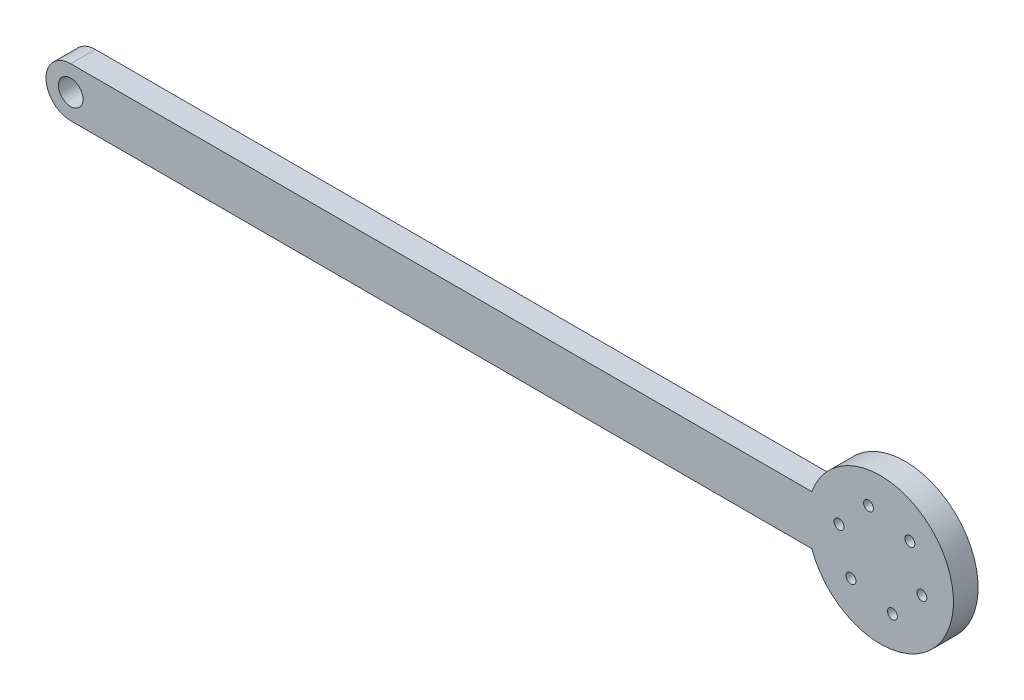
ISO-10303-21;
HEADER;
FILE_DESCRIPTION(('STEP AP214'),'2;1');
FILE_NAME('part.step','',(''),(''),'','','');
FILE_SCHEMA(('AUTOMOTIVE_DESIGN { 1 0 10303 214 1 1 1 1 }'));
ENDSEC;
DATA;
#1=APPLICATION_CONTEXT('core data for automotive mechanical design processes');
#2=APPLICATION_PROTOCOL_DEFINITION('international standard','automotive_design',2000,#1);
#3=PRODUCT_CONTEXT('',#1,'mechanical');
#4=PRODUCT('Part','Part','',(#3));
#5=PRODUCT_RELATED_PRODUCT_CATEGORY('part','',(#4));
#6=PRODUCT_DEFINITION_FORMATION('','',#4);
#7=PRODUCT_DEFINITION_CONTEXT('part definition',#1,'design');
#8=PRODUCT_DEFINITION('design','',#6,#7);
#9=PRODUCT_DEFINITION_SHAPE('','',#8);
#10=(LENGTH_UNIT() NAMED_UNIT(*) SI_UNIT(.MILLI.,.METRE.));
#11=(NAMED_UNIT(*) PLANE_ANGLE_UNIT() SI_UNIT($,.RADIAN.));
#12=(NAMED_UNIT(*) SI_UNIT($,.STERADIAN.) SOLID_ANGLE_UNIT());
#13=UNCERTAINTY_MEASURE_WITH_UNIT(LENGTH_MEASURE(1.E-05),#10,'distance_accuracy_value','');
#14=(GEOMETRIC_REPRESENTATION_CONTEXT(3) GLOBAL_UNCERTAINTY_ASSIGNED_CONTEXT((#13)) GLOBAL_UNIT_ASSIGNED_CONTEXT((#10,
#11,#12)) REPRESENTATION_CONTEXT('',''));
#15=CARTESIAN_POINT('',(0.,0.,0.));
#16=DIRECTION('',(0.,0.,1.));
#17=DIRECTION('',(1.,0.,0.));
#18=AXIS2_PLACEMENT_3D('',#15,#16,#17);
#19=CARTESIAN_POINT('',(-73.6722189056612,18.1179103770456,10.));
#20=DIRECTION('',(0.,0.,1.));
#21=DIRECTION('',(1.,0.,0.));
#22=AXIS2_PLACEMENT_3D('',#19,#20,#21);
#23=PLANE('',#22);
#24=CARTESIAN_POINT('',(242.217578637128,5.64432829585884,10.));
#25=DIRECTION('',(0.,0.,1.));
#26=DIRECTION('',(1.,0.,0.));
#27=AXIS2_PLACEMENT_3D('',#24,#25,#26);
#28=CIRCLE('',#27,1.99999999999998);
#29=CARTESIAN_POINT('',(244.217578637128,5.64432829585884,10.));
#30=VERTEX_POINT('',#29);
#31=EDGE_CURVE('E144',#30,#30,#28,.T.);
#32=ORIENTED_EDGE('',*,*,#31,.F.);
#33=EDGE_LOOP('',(#32));
#34=FACE_BOUND('',#33,.T.);
#35=CARTESIAN_POINT('',(270.892833899829,14.0358261132313,10.));
#36=DIRECTION('',(0.,0.,1.));
#37=DIRECTION('',(1.,0.,0.));
#38=AXIS2_PLACEMENT_3D('',#35,#36,#37);
#39=CIRCLE('',#38,1.99999999999994);
#40=CARTESIAN_POINT('',(272.892833899829,14.0358261132313,10.));
#41=VERTEX_POINT('',#40);
#42=EDGE_CURVE('E132',#41,#41,#39,.T.);
#43=ORIENTED_EDGE('',*,*,#42,.F.);
#44=EDGE_LOOP('',(#43));
#45=FACE_BOUND('',#44,.T.);
#46=CARTESIAN_POINT('',(249.287955982832,34.6735767220471,10.));
#47=DIRECTION('',(0.,0.,1.));
#48=DIRECTION('',(1.,0.,0.));
#49=AXIS2_PLACEMENT_3D('',#46,#47,#48);
#50=CIRCLE('',#49,1.99999999999997);
#51=CARTESIAN_POINT('',(251.287955982832,34.6735767220471,10.));
#52=VERTEX_POINT('',#51);
#53=EDGE_CURVE('E120',#52,#52,#50,.T.);
#54=ORIENTED_EDGE('',*,*,#53,.F.);
#55=EDGE_LOOP('',(#54));
#56=FACE_BOUND('',#55,.T.);
#57=CARTESIAN_POINT('',(-73.6722189056612,18.1179103770456,10.));
#58=DIRECTION('',(0.,0.,1.));
#59=DIRECTION('',(1.,0.,0.));
#60=AXIS2_PLACEMENT_3D('',#57,#58,#59);
#61=CIRCLE('',#60,10.);
#62=CARTESIAN_POINT('',(-73.6722189056612,28.1179103770456,10.));
#63=VERTEX_POINT('',#62);
#64=CARTESIAN_POINT('',(-73.6722189056612,8.11791037704561,10.));
#65=VERTEX_POINT('',#64);
#66=EDGE_CURVE('E90',#63,#65,#61,.T.);
#67=ORIENTED_EDGE('',*,*,#66,.T.);
#68=DIRECTION('',(1.,0.,0.));
#69=VECTOR('',#68,1.);
#70=CARTESIAN_POINT('',(-73.6722189056612,8.11791037704561,10.));
#71=LINE('',#70,#69);
#72=CARTESIAN_POINT('',(226.327781094339,8.1179103770456,10.));
#73=VERTEX_POINT('',#72);
#74=EDGE_CURVE('E85',#65,#73,#71,.T.);
#75=ORIENTED_EDGE('',*,*,#74,.T.);
#76=CARTESIAN_POINT('',(254.132789506596,18.1179103770456,10.));
#77=DIRECTION('',(0.,0.,1.));
#78=DIRECTION('',(-1.,0.,0.));
#79=AXIS2_PLACEMENT_3D('',#76,#77,#78);
#80=CIRCLE('',#79,29.5485785242826);
#81=CARTESIAN_POINT('',(226.327781094339,28.1179103770456,10.));
#82=VERTEX_POINT('',#81);
#83=EDGE_CURVE('E88',#73,#82,#80,.T.);
#84=ORIENTED_EDGE('',*,*,#83,.T.);
#85=DIRECTION('',(-1.,0.,0.));
#86=VECTOR('',#85,1.);
#87=CARTESIAN_POINT('',(-73.6722189056612,28.1179103770456,10.));
#88=LINE('',#87,#86);
#89=EDGE_CURVE('E55',#82,#63,#88,.T.);
#90=ORIENTED_EDGE('',*,*,#89,.T.);
#91=EDGE_LOOP('',(#67,#75,#84,#90));
#92=FACE_BOUND('',#91,.T.);
#93=CARTESIAN_POINT('',(-73.6722189056612,18.1179103770456,10.));
#94=DIRECTION('',(0.,0.,1.));
#95=DIRECTION('',(1.,0.,0.));
#96=AXIS2_PLACEMENT_3D('',#93,#94,#95);
#97=CIRCLE('',#96,5.);
#98=CARTESIAN_POINT('',(-68.6722189056612,18.1179103770456,10.));
#99=VERTEX_POINT('',#98);
#100=EDGE_CURVE('E105',#99,#99,#97,.T.);
#101=ORIENTED_EDGE('',*,*,#100,.F.);
#102=EDGE_LOOP('',(#101));
#103=FACE_BOUND('',#102,.T.);
#104=CARTESIAN_POINT('',(266.048000376064,30.5914924582328,10.));
#105=DIRECTION('',(0.,0.,1.));
#106=DIRECTION('',(1.,0.,0.));
#107=AXIS2_PLACEMENT_3D('',#104,#105,#106);
#108=CIRCLE('',#107,2.);
#109=CARTESIAN_POINT('',(268.048000376064,30.5914924582328,10.));
#110=VERTEX_POINT('',#109);
#111=EDGE_CURVE('E126',#110,#110,#108,.T.);
#112=ORIENTED_EDGE('',*,*,#111,.F.);
#113=EDGE_LOOP('',(#112));
#114=FACE_BOUND('',#113,.T.);
#115=CARTESIAN_POINT('',(258.977623030361,1.56224403204439,10.));
#116=DIRECTION('',(0.,0.,1.));
#117=DIRECTION('',(1.,0.,0.));
#118=AXIS2_PLACEMENT_3D('',#115,#116,#117);
#119=CIRCLE('',#118,1.99999999999994);
#120=CARTESIAN_POINT('',(260.97762303036,1.56224403204439,10.));
#121=VERTEX_POINT('',#120);
#122=EDGE_CURVE('E138',#121,#121,#119,.T.);
#123=ORIENTED_EDGE('',*,*,#122,.F.);
#124=EDGE_LOOP('',(#123));
#125=FACE_BOUND('',#124,.T.);
#126=CARTESIAN_POINT('',(237.372745113364,22.1999946408603,10.));
#127=DIRECTION('',(0.,0.,1.));
#128=DIRECTION('',(1.,0.,0.));
#129=AXIS2_PLACEMENT_3D('',#126,#127,#128);
#130=CIRCLE('',#129,1.99999999999994);
#131=CARTESIAN_POINT('',(239.372745113364,22.1999946408603,10.));
#132=VERTEX_POINT('',#131);
#133=EDGE_CURVE('E150',#132,#132,#130,.T.);
#134=ORIENTED_EDGE('',*,*,#133,.F.);
#135=EDGE_LOOP('',(#134));
#136=FACE_BOUND('',#135,.T.);
#137=ADVANCED_FACE('F38',(#34,#45,#56,#92,#103,#114,#125,#136),#23,.T.);
#138=CARTESIAN_POINT('',(-73.6722189056612,18.1179103770456,0.));
#139=DIRECTION('',(0.,0.,1.));
#140=DIRECTION('',(1.,0.,0.));
#141=AXIS2_PLACEMENT_3D('',#138,#139,#140);
#142=PLANE('',#141);
#143=CARTESIAN_POINT('',(-73.6722189056612,18.1179103770456,0.));
#144=DIRECTION('',(0.,0.,1.));
#145=DIRECTION('',(1.,0.,0.));
#146=AXIS2_PLACEMENT_3D('',#143,#144,#145);
#147=CIRCLE('',#146,10.);
#148=CARTESIAN_POINT('',(-73.6722189056612,28.1179103770456,0.));
#149=VERTEX_POINT('',#148);
#150=CARTESIAN_POINT('',(-73.6722189056612,8.11791037704561,0.));
#151=VERTEX_POINT('',#150);
#152=EDGE_CURVE('E102',#149,#151,#147,.T.);
#153=ORIENTED_EDGE('',*,*,#152,.F.);
#154=DIRECTION('',(-1.,0.,0.));
#155=VECTOR('',#154,1.);
#156=CARTESIAN_POINT('',(-73.6722189056612,28.1179103770456,0.));
#157=LINE('',#156,#155);
#158=CARTESIAN_POINT('',(226.327781094339,28.1179103770456,0.));
#159=VERTEX_POINT('',#158);
#160=EDGE_CURVE('E78',#159,#149,#157,.T.);
#161=ORIENTED_EDGE('',*,*,#160,.F.);
#162=CARTESIAN_POINT('',(254.132789506596,18.1179103770456,0.));
#163=DIRECTION('',(0.,0.,1.));
#164=DIRECTION('',(-1.,0.,0.));
#165=AXIS2_PLACEMENT_3D('',#162,#163,#164);
#166=CIRCLE('',#165,29.5485785242826);
#167=CARTESIAN_POINT('',(226.327781094339,8.1179103770456,0.));
#168=VERTEX_POINT('',#167);
#169=EDGE_CURVE('E72',#168,#159,#166,.T.);
#170=ORIENTED_EDGE('',*,*,#169,.F.);
#171=DIRECTION('',(1.,0.,0.));
#172=VECTOR('',#171,1.);
#173=CARTESIAN_POINT('',(-73.6722189056612,8.11791037704561,0.));
#174=LINE('',#173,#172);
#175=EDGE_CURVE('E94',#151,#168,#174,.T.);
#176=ORIENTED_EDGE('',*,*,#175,.F.);
#177=EDGE_LOOP('',(#153,#161,#170,#176));
#178=FACE_BOUND('',#177,.T.);
#179=CARTESIAN_POINT('',(-73.6722189056612,18.1179103770456,0.));
#180=DIRECTION('',(0.,0.,1.));
#181=DIRECTION('',(1.,0.,0.));
#182=AXIS2_PLACEMENT_3D('',#179,#180,#181);
#183=CIRCLE('',#182,5.);
#184=CARTESIAN_POINT('',(-68.6722189056612,18.1179103770456,0.));
#185=VERTEX_POINT('',#184);
#186=EDGE_CURVE('E117',#185,#185,#183,.T.);
#187=ORIENTED_EDGE('',*,*,#186,.T.);
#188=EDGE_LOOP('',(#187));
#189=FACE_BOUND('',#188,.T.);
#190=CARTESIAN_POINT('',(249.287955982832,34.6735767220471,0.));
#191=DIRECTION('',(0.,0.,1.));
#192=DIRECTION('',(1.,0.,0.));
#193=AXIS2_PLACEMENT_3D('',#190,#191,#192);
#194=CIRCLE('',#193,1.99999999999997);
#195=CARTESIAN_POINT('',(251.287955982832,34.6735767220471,0.));
#196=VERTEX_POINT('',#195);
#197=EDGE_CURVE('E123',#196,#196,#194,.T.);
#198=ORIENTED_EDGE('',*,*,#197,.T.);
#199=EDGE_LOOP('',(#198));
#200=FACE_BOUND('',#199,.T.);
#201=CARTESIAN_POINT('',(266.048000376064,30.5914924582328,0.));
#202=DIRECTION('',(0.,0.,1.));
#203=DIRECTION('',(1.,0.,0.));
#204=AXIS2_PLACEMENT_3D('',#201,#202,#203);
#205=CIRCLE('',#204,2.);
#206=CARTESIAN_POINT('',(268.048000376064,30.5914924582328,0.));
#207=VERTEX_POINT('',#206);
#208=EDGE_CURVE('E129',#207,#207,#205,.T.);
#209=ORIENTED_EDGE('',*,*,#208,.T.);
#210=EDGE_LOOP('',(#209));
#211=FACE_BOUND('',#210,.T.);
#212=CARTESIAN_POINT('',(270.892833899829,14.0358261132313,0.));
#213=DIRECTION('',(0.,0.,1.));
#214=DIRECTION('',(1.,0.,0.));
#215=AXIS2_PLACEMENT_3D('',#212,#213,#214);
#216=CIRCLE('',#215,1.99999999999994);
#217=CARTESIAN_POINT('',(272.892833899829,14.0358261132313,0.));
#218=VERTEX_POINT('',#217);
#219=EDGE_CURVE('E135',#218,#218,#216,.T.);
#220=ORIENTED_EDGE('',*,*,#219,.T.);
#221=EDGE_LOOP('',(#220));
#222=FACE_BOUND('',#221,.T.);
#223=CARTESIAN_POINT('',(258.977623030361,1.56224403204439,0.));
#224=DIRECTION('',(0.,0.,1.));
#225=DIRECTION('',(1.,0.,0.));
#226=AXIS2_PLACEMENT_3D('',#223,#224,#225);
#227=CIRCLE('',#226,1.99999999999994);
#228=CARTESIAN_POINT('',(260.97762303036,1.56224403204439,0.));
#229=VERTEX_POINT('',#228);
#230=EDGE_CURVE('E141',#229,#229,#227,.T.);
#231=ORIENTED_EDGE('',*,*,#230,.T.);
#232=EDGE_LOOP('',(#231));
#233=FACE_BOUND('',#232,.T.);
#234=CARTESIAN_POINT('',(242.217578637128,5.64432829585884,0.));
#235=DIRECTION('',(0.,0.,1.));
#236=DIRECTION('',(1.,0.,0.));
#237=AXIS2_PLACEMENT_3D('',#234,#235,#236);
#238=CIRCLE('',#237,1.99999999999998);
#239=CARTESIAN_POINT('',(244.217578637128,5.64432829585884,0.));
#240=VERTEX_POINT('',#239);
#241=EDGE_CURVE('E147',#240,#240,#238,.T.);
#242=ORIENTED_EDGE('',*,*,#241,.T.);
#243=EDGE_LOOP('',(#242));
#244=FACE_BOUND('',#243,.T.);
#245=CARTESIAN_POINT('',(237.372745113364,22.1999946408603,0.));
#246=DIRECTION('',(0.,0.,1.));
#247=DIRECTION('',(1.,0.,0.));
#248=AXIS2_PLACEMENT_3D('',#245,#246,#247);
#249=CIRCLE('',#248,1.99999999999994);
#250=CARTESIAN_POINT('',(239.372745113364,22.1999946408603,0.));
#251=VERTEX_POINT('',#250);
#252=EDGE_CURVE('E153',#251,#251,#249,.T.);
#253=ORIENTED_EDGE('',*,*,#252,.T.);
#254=EDGE_LOOP('',(#253));
#255=FACE_BOUND('',#254,.T.);
#256=ADVANCED_FACE('F113',(#178,#189,#200,#211,#222,#233,#244,#255),#142,.F.);
#257=CARTESIAN_POINT('',(-73.6722189056612,18.1179103770456,10.));
#258=DIRECTION('',(0.,0.,-1.));
#259=DIRECTION('',(-1.,0.,0.));
#260=AXIS2_PLACEMENT_3D('',#257,#258,#259);
#261=CYLINDRICAL_SURFACE('',#260,10.);
#262=ORIENTED_EDGE('',*,*,#152,.T.);
#263=DIRECTION('',(0.,0.,-1.));
#264=VECTOR('',#263,1.);
#265=CARTESIAN_POINT('',(-73.6722189056612,8.11791037704561,10.));
#266=LINE('',#265,#264);
#267=EDGE_CURVE('E11',#65,#151,#266,.T.);
#268=ORIENTED_EDGE('',*,*,#267,.F.);
#269=ORIENTED_EDGE('',*,*,#66,.F.);
#270=DIRECTION('',(0.,0.,-1.));
#271=VECTOR('',#270,1.);
#272=CARTESIAN_POINT('',(-73.6722189056612,28.1179103770456,10.));
#273=LINE('',#272,#271);
#274=EDGE_CURVE('E98',#63,#149,#273,.T.);
#275=ORIENTED_EDGE('',*,*,#274,.T.);
#276=EDGE_LOOP('',(#262,#268,#269,#275));
#277=FACE_BOUND('',#276,.T.);
#278=ADVANCED_FACE('F40',(#277),#261,.T.);
#279=CARTESIAN_POINT('',(-73.6722189056612,8.11791037704561,10.));
#280=DIRECTION('',(0.,1.,0.));
#281=DIRECTION('',(0.,0.,1.));
#282=AXIS2_PLACEMENT_3D('',#279,#280,#281);
#283=PLANE('',#282);
#284=ORIENTED_EDGE('',*,*,#175,.T.);
#285=DIRECTION('',(0.,0.,-1.));
#286=VECTOR('',#285,1.);
#287=CARTESIAN_POINT('',(226.327781094339,8.1179103770456,10.));
#288=LINE('',#287,#286);
#289=EDGE_CURVE('E47',#73,#168,#288,.T.);
#290=ORIENTED_EDGE('',*,*,#289,.F.);
#291=ORIENTED_EDGE('',*,*,#74,.F.);
#292=ORIENTED_EDGE('',*,*,#267,.T.);
#293=EDGE_LOOP('',(#284,#290,#291,#292));
#294=FACE_BOUND('',#293,.T.);
#295=ADVANCED_FACE('F93',(#294),#283,.F.);
#296=CARTESIAN_POINT('',(254.132789506596,18.1179103770456,10.));
#297=DIRECTION('',(0.,0.,-1.));
#298=DIRECTION('',(-1.,0.,0.));
#299=AXIS2_PLACEMENT_3D('',#296,#297,#298);
#300=CYLINDRICAL_SURFACE('',#299,29.5485785242826);
#301=ORIENTED_EDGE('',*,*,#169,.T.);
#302=DIRECTION('',(0.,0.,-1.));
#303=VECTOR('',#302,1.);
#304=CARTESIAN_POINT('',(226.327781094339,28.1179103770456,10.));
#305=LINE('',#304,#303);
#306=EDGE_CURVE('E95',#82,#159,#305,.T.);
#307=ORIENTED_EDGE('',*,*,#306,.F.);
#308=ORIENTED_EDGE('',*,*,#83,.F.);
#309=ORIENTED_EDGE('',*,*,#289,.T.);
#310=EDGE_LOOP('',(#301,#307,#308,#309));
#311=FACE_BOUND('',#310,.T.);
#312=ADVANCED_FACE('F96',(#311),#300,.T.);
#313=CARTESIAN_POINT('',(-73.6722189056612,28.1179103770456,10.));
#314=DIRECTION('',(0.,-1.,0.));
#315=DIRECTION('',(0.,0.,-1.));
#316=AXIS2_PLACEMENT_3D('',#313,#314,#315);
#317=PLANE('',#316);
#318=ORIENTED_EDGE('',*,*,#160,.T.);
#319=ORIENTED_EDGE('',*,*,#274,.F.);
#320=ORIENTED_EDGE('',*,*,#89,.F.);
#321=ORIENTED_EDGE('',*,*,#306,.T.);
#322=EDGE_LOOP('',(#318,#319,#320,#321));
#323=FACE_BOUND('',#322,.T.);
#324=ADVANCED_FACE('F110',(#323),#317,.F.);
#325=CARTESIAN_POINT('',(-73.6722189056612,18.1179103770456,10.));
#326=DIRECTION('',(0.,0.,-1.));
#327=DIRECTION('',(-1.,0.,0.));
#328=AXIS2_PLACEMENT_3D('',#325,#326,#327);
#329=CYLINDRICAL_SURFACE('',#328,5.);
#330=ORIENTED_EDGE('',*,*,#100,.T.);
#331=EDGE_LOOP('',(#330));
#332=FACE_BOUND('',#331,.T.);
#333=ORIENTED_EDGE('',*,*,#186,.F.);
#334=EDGE_LOOP('',(#333));
#335=FACE_BOUND('',#334,.T.);
#336=ADVANCED_FACE('F172',(#332,#335),#329,.F.);
#337=CARTESIAN_POINT('',(249.287955982832,34.6735767220471,10.));
#338=DIRECTION('',(0.,0.,-1.));
#339=DIRECTION('',(-1.,0.,0.));
#340=AXIS2_PLACEMENT_3D('',#337,#338,#339);
#341=CYLINDRICAL_SURFACE('',#340,1.99999999999997);
#342=ORIENTED_EDGE('',*,*,#53,.T.);
#343=EDGE_LOOP('',(#342));
#344=FACE_BOUND('',#343,.T.);
#345=ORIENTED_EDGE('',*,*,#197,.F.);
#346=EDGE_LOOP('',(#345));
#347=FACE_BOUND('',#346,.T.);
#348=ADVANCED_FACE('F217',(#344,#347),#341,.F.);
#349=CARTESIAN_POINT('',(266.048000376064,30.5914924582328,10.));
#350=DIRECTION('',(0.,0.,-1.));
#351=DIRECTION('',(-1.,0.,0.));
#352=AXIS2_PLACEMENT_3D('',#349,#350,#351);
#353=CYLINDRICAL_SURFACE('',#352,2.);
#354=ORIENTED_EDGE('',*,*,#111,.T.);
#355=EDGE_LOOP('',(#354));
#356=FACE_BOUND('',#355,.T.);
#357=ORIENTED_EDGE('',*,*,#208,.F.);
#358=EDGE_LOOP('',(#357));
#359=FACE_BOUND('',#358,.T.);
#360=ADVANCED_FACE('F225',(#356,#359),#353,.F.);
#361=CARTESIAN_POINT('',(270.892833899829,14.0358261132313,10.));
#362=DIRECTION('',(0.,0.,-1.));
#363=DIRECTION('',(-1.,0.,0.));
#364=AXIS2_PLACEMENT_3D('',#361,#362,#363);
#365=CYLINDRICAL_SURFACE('',#364,1.99999999999994);
#366=ORIENTED_EDGE('',*,*,#42,.T.);
#367=EDGE_LOOP('',(#366));
#368=FACE_BOUND('',#367,.T.);
#369=ORIENTED_EDGE('',*,*,#219,.F.);
#370=EDGE_LOOP('',(#369));
#371=FACE_BOUND('',#370,.T.);
#372=ADVANCED_FACE('F233',(#368,#371),#365,.F.);
#373=CARTESIAN_POINT('',(258.977623030361,1.56224403204439,10.));
#374=DIRECTION('',(0.,0.,-1.));
#375=DIRECTION('',(-1.,0.,0.));
#376=AXIS2_PLACEMENT_3D('',#373,#374,#375);
#377=CYLINDRICAL_SURFACE('',#376,1.99999999999994);
#378=ORIENTED_EDGE('',*,*,#122,.T.);
#379=EDGE_LOOP('',(#378));
#380=FACE_BOUND('',#379,.T.);
#381=ORIENTED_EDGE('',*,*,#230,.F.);
#382=EDGE_LOOP('',(#381));
#383=FACE_BOUND('',#382,.T.);
#384=ADVANCED_FACE('F242',(#380,#383),#377,.F.);
#385=CARTESIAN_POINT('',(242.217578637128,5.64432829585884,10.));
#386=DIRECTION('',(0.,0.,-1.));
#387=DIRECTION('',(-1.,0.,0.));
#388=AXIS2_PLACEMENT_3D('',#385,#386,#387);
#389=CYLINDRICAL_SURFACE('',#388,1.99999999999998);
#390=ORIENTED_EDGE('',*,*,#31,.T.);
#391=EDGE_LOOP('',(#390));
#392=FACE_BOUND('',#391,.T.);
#393=ORIENTED_EDGE('',*,*,#241,.F.);
#394=EDGE_LOOP('',(#393));
#395=FACE_BOUND('',#394,.T.);
#396=ADVANCED_FACE('F251',(#392,#395),#389,.F.);
#397=CARTESIAN_POINT('',(237.372745113364,22.1999946408603,10.));
#398=DIRECTION('',(0.,0.,-1.));
#399=DIRECTION('',(-1.,0.,0.));
#400=AXIS2_PLACEMENT_3D('',#397,#398,#399);
#401=CYLINDRICAL_SURFACE('',#400,1.99999999999994);
#402=ORIENTED_EDGE('',*,*,#133,.T.);
#403=EDGE_LOOP('',(#402));
#404=FACE_BOUND('',#403,.T.);
#405=ORIENTED_EDGE('',*,*,#252,.F.);
#406=EDGE_LOOP('',(#405));
#407=FACE_BOUND('',#406,.T.);
#408=ADVANCED_FACE('F159',(#404,#407),#401,.F.);
#409=CLOSED_SHELL('',(#137,#256,#278,#295,#312,#324,#336,#348,#360,#372,#384,#396,#408));
#410=MANIFOLD_SOLID_BREP('B2',#409);
#411=ADVANCED_BREP_SHAPE_REPRESENTATION('',(#18,#410),#14);
#412=SHAPE_DEFINITION_REPRESENTATION(#9,#411);
ENDSEC;
END-ISO-10303-21;
